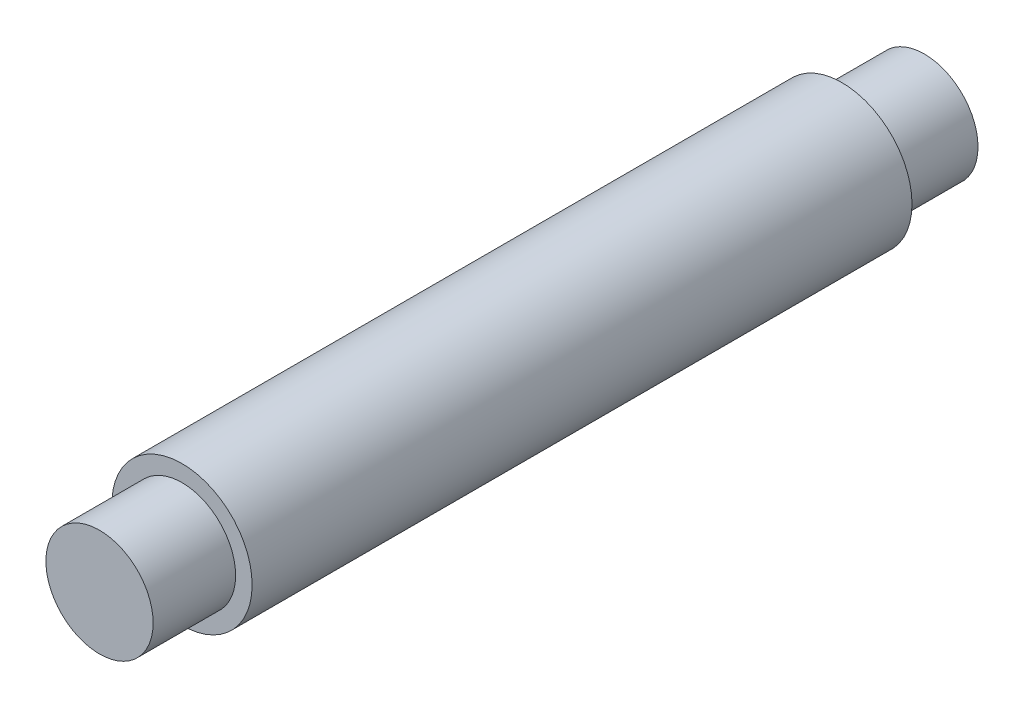
ISO-10303-21;
HEADER;
FILE_DESCRIPTION(('STEP AP214'),'2;1');
FILE_NAME('part.step','',(''),(''),'','','');
FILE_SCHEMA(('AUTOMOTIVE_DESIGN { 1 0 10303 214 1 1 1 1 }'));
ENDSEC;
DATA;
#1=APPLICATION_CONTEXT('core data for automotive mechanical design processes');
#2=APPLICATION_PROTOCOL_DEFINITION('international standard','automotive_design',2000,#1);
#3=PRODUCT_CONTEXT('',#1,'mechanical');
#4=PRODUCT('Part','Part','',(#3));
#5=PRODUCT_RELATED_PRODUCT_CATEGORY('part','',(#4));
#6=PRODUCT_DEFINITION_FORMATION('','',#4);
#7=PRODUCT_DEFINITION_CONTEXT('part definition',#1,'design');
#8=PRODUCT_DEFINITION('design','',#6,#7);
#9=PRODUCT_DEFINITION_SHAPE('','',#8);
#10=(LENGTH_UNIT() NAMED_UNIT(*) SI_UNIT(.MILLI.,.METRE.));
#11=(NAMED_UNIT(*) PLANE_ANGLE_UNIT() SI_UNIT($,.RADIAN.));
#12=(NAMED_UNIT(*) SI_UNIT($,.STERADIAN.) SOLID_ANGLE_UNIT());
#13=UNCERTAINTY_MEASURE_WITH_UNIT(LENGTH_MEASURE(1.E-05),#10,'distance_accuracy_value','');
#14=(GEOMETRIC_REPRESENTATION_CONTEXT(3) GLOBAL_UNCERTAINTY_ASSIGNED_CONTEXT((#13)) GLOBAL_UNIT_ASSIGNED_CONTEXT((#10,
#11,#12)) REPRESENTATION_CONTEXT('',''));
#15=CARTESIAN_POINT('',(0.,0.,0.));
#16=DIRECTION('',(0.,0.,1.));
#17=DIRECTION('',(1.,0.,0.));
#18=AXIS2_PLACEMENT_3D('',#15,#16,#17);
#19=CARTESIAN_POINT('',(0.,0.,80.));
#20=DIRECTION('',(0.,0.,-1.));
#21=DIRECTION('',(-1.,0.,0.));
#22=AXIS2_PLACEMENT_3D('',#19,#20,#21);
#23=CYLINDRICAL_SURFACE('',#22,8.5);
#24=CARTESIAN_POINT('',(0.,0.,80.));
#25=DIRECTION('',(0.,0.,1.));
#26=DIRECTION('',(1.,0.,0.));
#27=AXIS2_PLACEMENT_3D('',#24,#25,#26);
#28=CIRCLE('',#27,8.5);
#29=CARTESIAN_POINT('',(8.5,0.,80.));
#30=VERTEX_POINT('',#29);
#31=EDGE_CURVE('E38',#30,#30,#28,.T.);
#32=ORIENTED_EDGE('',*,*,#31,.F.);
#33=EDGE_LOOP('',(#32));
#34=FACE_BOUND('',#33,.T.);
#35=CARTESIAN_POINT('',(0.,0.,0.));
#36=DIRECTION('',(0.,0.,1.));
#37=DIRECTION('',(1.,0.,0.));
#38=AXIS2_PLACEMENT_3D('',#35,#36,#37);
#39=CIRCLE('',#38,8.5);
#40=CARTESIAN_POINT('',(8.5,0.,0.));
#41=VERTEX_POINT('',#40);
#42=EDGE_CURVE('E42',#41,#41,#39,.T.);
#43=ORIENTED_EDGE('',*,*,#42,.T.);
#44=EDGE_LOOP('',(#43));
#45=FACE_BOUND('',#44,.T.);
#46=ADVANCED_FACE('F32',(#34,#45),#23,.T.);
#47=CARTESIAN_POINT('',(0.,0.,80.));
#48=DIRECTION('',(0.,0.,1.));
#49=DIRECTION('',(1.,0.,0.));
#50=AXIS2_PLACEMENT_3D('',#47,#48,#49);
#51=PLANE('',#50);
#52=CARTESIAN_POINT('',(0.,0.,80.));
#53=DIRECTION('',(0.,0.,1.));
#54=DIRECTION('',(1.,0.,0.));
#55=AXIS2_PLACEMENT_3D('',#52,#53,#54);
#56=CIRCLE('',#55,6.5);
#57=CARTESIAN_POINT('',(6.5,0.,80.));
#58=VERTEX_POINT('',#57);
#59=EDGE_CURVE('E49',#58,#58,#56,.T.);
#60=ORIENTED_EDGE('',*,*,#59,.F.);
#61=EDGE_LOOP('',(#60));
#62=FACE_BOUND('',#61,.T.);
#63=ORIENTED_EDGE('',*,*,#31,.T.);
#64=EDGE_LOOP('',(#63));
#65=FACE_BOUND('',#64,.T.);
#66=ADVANCED_FACE('F73',(#62,#65),#51,.T.);
#67=CARTESIAN_POINT('',(0.,0.,0.));
#68=DIRECTION('',(0.,0.,1.));
#69=DIRECTION('',(1.,0.,0.));
#70=AXIS2_PLACEMENT_3D('',#67,#68,#69);
#71=PLANE('',#70);
#72=CARTESIAN_POINT('',(0.,0.,0.));
#73=DIRECTION('',(0.,0.,1.));
#74=DIRECTION('',(1.,0.,0.));
#75=AXIS2_PLACEMENT_3D('',#72,#73,#74);
#76=CIRCLE('',#75,6.5);
#77=CARTESIAN_POINT('',(6.5,0.,0.));
#78=VERTEX_POINT('',#77);
#79=EDGE_CURVE('E10',#78,#78,#76,.F.);
#80=ORIENTED_EDGE('',*,*,#79,.F.);
#81=EDGE_LOOP('',(#80));
#82=FACE_BOUND('',#81,.T.);
#83=ORIENTED_EDGE('',*,*,#42,.F.);
#84=EDGE_LOOP('',(#83));
#85=FACE_BOUND('',#84,.T.);
#86=ADVANCED_FACE('F78',(#82,#85),#71,.F.);
#87=CARTESIAN_POINT('',(0.,0.,90.));
#88=DIRECTION('',(0.,0.,-1.));
#89=DIRECTION('',(-1.,0.,0.));
#90=AXIS2_PLACEMENT_3D('',#87,#88,#89);
#91=CYLINDRICAL_SURFACE('',#90,6.5);
#92=CARTESIAN_POINT('',(0.,0.,90.));
#93=DIRECTION('',(0.,0.,1.));
#94=DIRECTION('',(1.,0.,0.));
#95=AXIS2_PLACEMENT_3D('',#92,#93,#94);
#96=CIRCLE('',#95,6.5);
#97=CARTESIAN_POINT('',(6.5,0.,90.));
#98=VERTEX_POINT('',#97);
#99=EDGE_CURVE('E47',#98,#98,#96,.T.);
#100=ORIENTED_EDGE('',*,*,#99,.F.);
#101=EDGE_LOOP('',(#100));
#102=FACE_BOUND('',#101,.T.);
#103=ORIENTED_EDGE('',*,*,#59,.T.);
#104=EDGE_LOOP('',(#103));
#105=FACE_BOUND('',#104,.T.);
#106=ADVANCED_FACE('F69',(#102,#105),#91,.T.);
#107=CARTESIAN_POINT('',(0.,0.,90.));
#108=DIRECTION('',(0.,0.,1.));
#109=DIRECTION('',(1.,0.,0.));
#110=AXIS2_PLACEMENT_3D('',#107,#108,#109);
#111=PLANE('',#110);
#112=ORIENTED_EDGE('',*,*,#99,.T.);
#113=EDGE_LOOP('',(#112));
#114=FACE_BOUND('',#113,.T.);
#115=ADVANCED_FACE('F62',(#114),#111,.T.);
#116=CARTESIAN_POINT('',(0.,0.,-10.));
#117=DIRECTION('',(0.,0.,1.));
#118=DIRECTION('',(1.,0.,0.));
#119=AXIS2_PLACEMENT_3D('',#116,#117,#118);
#120=CYLINDRICAL_SURFACE('',#119,6.5);
#121=CARTESIAN_POINT('',(0.,0.,-10.));
#122=DIRECTION('',(0.,0.,-1.));
#123=DIRECTION('',(-1.,0.,0.));
#124=AXIS2_PLACEMENT_3D('',#121,#122,#123);
#125=CIRCLE('',#124,6.5);
#126=CARTESIAN_POINT('',(-6.5,0.,-10.));
#127=VERTEX_POINT('',#126);
#128=EDGE_CURVE('E52',#127,#127,#125,.T.);
#129=ORIENTED_EDGE('',*,*,#128,.F.);
#130=EDGE_LOOP('',(#129));
#131=FACE_BOUND('',#130,.T.);
#132=ORIENTED_EDGE('',*,*,#79,.T.);
#133=EDGE_LOOP('',(#132));
#134=FACE_BOUND('',#133,.T.);
#135=ADVANCED_FACE('F60',(#131,#134),#120,.T.);
#136=CARTESIAN_POINT('',(0.,0.,-10.));
#137=DIRECTION('',(0.,0.,-1.));
#138=DIRECTION('',(-1.,0.,0.));
#139=AXIS2_PLACEMENT_3D('',#136,#137,#138);
#140=PLANE('',#139);
#141=ORIENTED_EDGE('',*,*,#128,.T.);
#142=EDGE_LOOP('',(#141));
#143=FACE_BOUND('',#142,.T.);
#144=ADVANCED_FACE('F58',(#143),#140,.T.);
#145=CLOSED_SHELL('',(#46,#66,#86,#106,#115,#135,#144));
#146=MANIFOLD_SOLID_BREP('B2',#145);
#147=ADVANCED_BREP_SHAPE_REPRESENTATION('',(#18,#146),#14);
#148=SHAPE_DEFINITION_REPRESENTATION(#9,#147);
ENDSEC;
END-ISO-10303-21;
